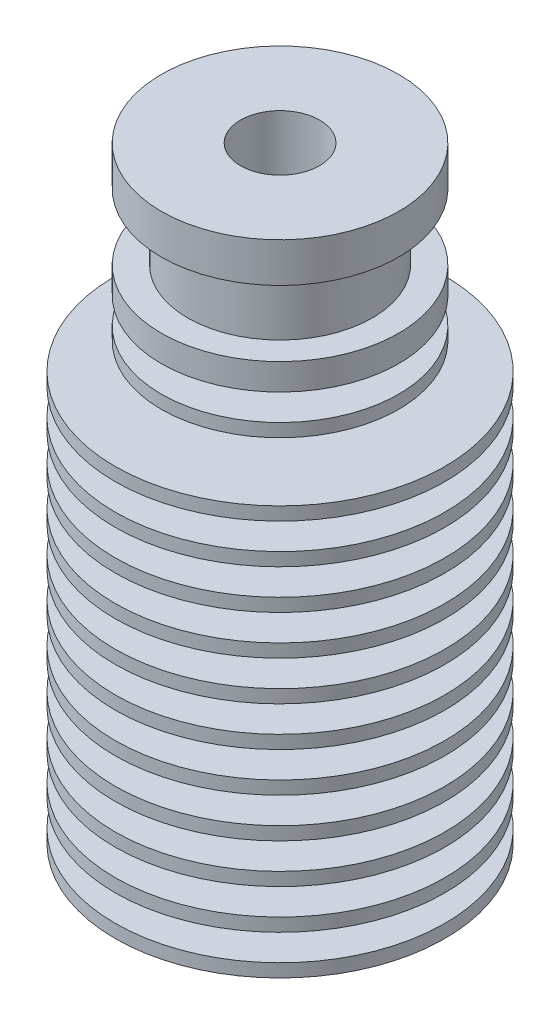
ISO-10303-21;
HEADER;
FILE_DESCRIPTION(('STEP AP214'),'2;1');
FILE_NAME('part.step','',(''),(''),'','','');
FILE_SCHEMA(('AUTOMOTIVE_DESIGN { 1 0 10303 214 1 1 1 1 }'));
ENDSEC;
DATA;
#1=APPLICATION_CONTEXT('core data for automotive mechanical design processes');
#2=APPLICATION_PROTOCOL_DEFINITION('international standard','automotive_design',2000,#1);
#3=PRODUCT_CONTEXT('',#1,'mechanical');
#4=PRODUCT('Part','Part','',(#3));
#5=PRODUCT_RELATED_PRODUCT_CATEGORY('part','',(#4));
#6=PRODUCT_DEFINITION_FORMATION('','',#4);
#7=PRODUCT_DEFINITION_CONTEXT('part definition',#1,'design');
#8=PRODUCT_DEFINITION('design','',#6,#7);
#9=PRODUCT_DEFINITION_SHAPE('','',#8);
#10=(LENGTH_UNIT() NAMED_UNIT(*) SI_UNIT(.MILLI.,.METRE.));
#11=(NAMED_UNIT(*) PLANE_ANGLE_UNIT() SI_UNIT($,.RADIAN.));
#12=(NAMED_UNIT(*) SI_UNIT($,.STERADIAN.) SOLID_ANGLE_UNIT());
#13=UNCERTAINTY_MEASURE_WITH_UNIT(LENGTH_MEASURE(1.E-05),#10,'distance_accuracy_value','');
#14=(GEOMETRIC_REPRESENTATION_CONTEXT(3) GLOBAL_UNCERTAINTY_ASSIGNED_CONTEXT((#13)) GLOBAL_UNIT_ASSIGNED_CONTEXT((#10,
#11,#12)) REPRESENTATION_CONTEXT('',''));
#15=CARTESIAN_POINT('',(0.,0.,0.));
#16=DIRECTION('',(0.,0.,1.));
#17=DIRECTION('',(1.,0.,0.));
#18=AXIS2_PLACEMENT_3D('',#15,#16,#17);
#19=CARTESIAN_POINT('',(0.,1.,0.));
#20=DIRECTION('',(0.,-1.,0.));
#21=DIRECTION('',(0.,0.,-1.));
#22=AXIS2_PLACEMENT_3D('',#19,#20,#21);
#23=CYLINDRICAL_SURFACE('',#22,12.5);
#24=CARTESIAN_POINT('',(0.,1.,0.));
#25=DIRECTION('',(0.,1.,0.));
#26=DIRECTION('',(0.,0.,1.));
#27=AXIS2_PLACEMENT_3D('',#24,#25,#26);
#28=CIRCLE('',#27,12.5);
#29=CARTESIAN_POINT('',(0.,1.,12.5));
#30=VERTEX_POINT('',#29);
#31=EDGE_CURVE('E245',#30,#30,#28,.T.);
#32=ORIENTED_EDGE('',*,*,#31,.F.);
#33=EDGE_LOOP('',(#32));
#34=FACE_BOUND('',#33,.T.);
#35=CARTESIAN_POINT('',(0.,0.,0.));
#36=DIRECTION('',(0.,1.,0.));
#37=DIRECTION('',(0.,0.,1.));
#38=AXIS2_PLACEMENT_3D('',#35,#36,#37);
#39=CIRCLE('',#38,12.5);
#40=CARTESIAN_POINT('',(0.,0.,12.5));
#41=VERTEX_POINT('',#40);
#42=EDGE_CURVE('E42',#41,#41,#39,.T.);
#43=ORIENTED_EDGE('',*,*,#42,.T.);
#44=EDGE_LOOP('',(#43));
#45=FACE_BOUND('',#44,.T.);
#46=ADVANCED_FACE('F39',(#34,#45),#23,.T.);
#47=CARTESIAN_POINT('',(0.,1.,0.));
#48=DIRECTION('',(0.,1.,0.));
#49=DIRECTION('',(0.,0.,1.));
#50=AXIS2_PLACEMENT_3D('',#47,#48,#49);
#51=PLANE('',#50);
#52=CARTESIAN_POINT('',(0.,1.,0.));
#53=DIRECTION('',(0.,1.,0.));
#54=DIRECTION('',(0.,0.,1.));
#55=AXIS2_PLACEMENT_3D('',#52,#53,#54);
#56=CIRCLE('',#55,4.);
#57=CARTESIAN_POINT('',(0.,1.,4.));
#58=VERTEX_POINT('',#57);
#59=EDGE_CURVE('E231',#58,#58,#56,.T.);
#60=ORIENTED_EDGE('',*,*,#59,.F.);
#61=EDGE_LOOP('',(#60));
#62=FACE_BOUND('',#61,.T.);
#63=ORIENTED_EDGE('',*,*,#31,.T.);
#64=EDGE_LOOP('',(#63));
#65=FACE_BOUND('',#64,.T.);
#66=ADVANCED_FACE('F258',(#62,#65),#51,.T.);
#67=CARTESIAN_POINT('',(0.,0.,0.));
#68=DIRECTION('',(0.,1.,0.));
#69=DIRECTION('',(0.,0.,1.));
#70=AXIS2_PLACEMENT_3D('',#67,#68,#69);
#71=PLANE('',#70);
#72=CARTESIAN_POINT('',(0.,0.,0.));
#73=DIRECTION('',(0.,-1.,0.));
#74=DIRECTION('',(0.,0.,-1.));
#75=AXIS2_PLACEMENT_3D('',#72,#73,#74);
#76=CIRCLE('',#75,3.);
#77=CARTESIAN_POINT('',(0.,0.,-3.));
#78=VERTEX_POINT('',#77);
#79=EDGE_CURVE('E816',#78,#78,#76,.T.);
#80=ORIENTED_EDGE('',*,*,#79,.F.);
#81=EDGE_LOOP('',(#80));
#82=FACE_BOUND('',#81,.T.);
#83=ORIENTED_EDGE('',*,*,#42,.F.);
#84=EDGE_LOOP('',(#83));
#85=FACE_BOUND('',#84,.T.);
#86=ADVANCED_FACE('F255',(#82,#85),#71,.F.);
#87=CARTESIAN_POINT('',(0.,3.,0.));
#88=DIRECTION('',(0.,-1.,0.));
#89=DIRECTION('',(0.,0.,-1.));
#90=AXIS2_PLACEMENT_3D('',#87,#88,#89);
#91=CYLINDRICAL_SURFACE('',#90,4.);
#92=CARTESIAN_POINT('',(0.,3.,0.));
#93=DIRECTION('',(0.,1.,0.));
#94=DIRECTION('',(0.,0.,1.));
#95=AXIS2_PLACEMENT_3D('',#92,#93,#94);
#96=CIRCLE('',#95,4.);
#97=CARTESIAN_POINT('',(0.,3.,4.));
#98=VERTEX_POINT('',#97);
#99=EDGE_CURVE('E236',#98,#98,#96,.T.);
#100=ORIENTED_EDGE('',*,*,#99,.F.);
#101=EDGE_LOOP('',(#100));
#102=FACE_BOUND('',#101,.T.);
#103=ORIENTED_EDGE('',*,*,#59,.T.);
#104=EDGE_LOOP('',(#103));
#105=FACE_BOUND('',#104,.T.);
#106=ADVANCED_FACE('F257',(#102,#105),#91,.T.);
#107=CARTESIAN_POINT('',(0.,4.,0.));
#108=DIRECTION('',(0.,-1.,0.));
#109=DIRECTION('',(0.,0.,-1.));
#110=AXIS2_PLACEMENT_3D('',#107,#108,#109);
#111=CYLINDRICAL_SURFACE('',#110,12.5);
#112=CARTESIAN_POINT('',(0.,4.,0.));
#113=DIRECTION('',(0.,1.,0.));
#114=DIRECTION('',(0.,0.,1.));
#115=AXIS2_PLACEMENT_3D('',#112,#113,#114);
#116=CIRCLE('',#115,12.5);
#117=CARTESIAN_POINT('',(0.,4.,12.5));
#118=VERTEX_POINT('',#117);
#119=EDGE_CURVE('E232',#118,#118,#116,.T.);
#120=ORIENTED_EDGE('',*,*,#119,.F.);
#121=EDGE_LOOP('',(#120));
#122=FACE_BOUND('',#121,.T.);
#123=CARTESIAN_POINT('',(0.,3.,0.));
#124=DIRECTION('',(0.,1.,0.));
#125=DIRECTION('',(0.,0.,1.));
#126=AXIS2_PLACEMENT_3D('',#123,#124,#125);
#127=CIRCLE('',#126,12.5);
#128=CARTESIAN_POINT('',(0.,3.,12.5));
#129=VERTEX_POINT('',#128);
#130=EDGE_CURVE('E227',#129,#129,#127,.T.);
#131=ORIENTED_EDGE('',*,*,#130,.T.);
#132=EDGE_LOOP('',(#131));
#133=FACE_BOUND('',#132,.T.);
#134=ADVANCED_FACE('F264',(#122,#133),#111,.T.);
#135=CARTESIAN_POINT('',(0.,4.,0.));
#136=DIRECTION('',(0.,1.,0.));
#137=DIRECTION('',(0.,0.,1.));
#138=AXIS2_PLACEMENT_3D('',#135,#136,#137);
#139=PLANE('',#138);
#140=CARTESIAN_POINT('',(0.,4.,0.));
#141=DIRECTION('',(0.,1.,0.));
#142=DIRECTION('',(0.,0.,1.));
#143=AXIS2_PLACEMENT_3D('',#140,#141,#142);
#144=CIRCLE('',#143,4.);
#145=CARTESIAN_POINT('',(0.,4.,4.));
#146=VERTEX_POINT('',#145);
#147=EDGE_CURVE('E215',#146,#146,#144,.T.);
#148=ORIENTED_EDGE('',*,*,#147,.F.);
#149=EDGE_LOOP('',(#148));
#150=FACE_BOUND('',#149,.T.);
#151=ORIENTED_EDGE('',*,*,#119,.T.);
#152=EDGE_LOOP('',(#151));
#153=FACE_BOUND('',#152,.T.);
#154=ADVANCED_FACE('F294',(#150,#153),#139,.T.);
#155=CARTESIAN_POINT('',(0.,3.,0.));
#156=DIRECTION('',(0.,1.,0.));
#157=DIRECTION('',(0.,0.,1.));
#158=AXIS2_PLACEMENT_3D('',#155,#156,#157);
#159=PLANE('',#158);
#160=ORIENTED_EDGE('',*,*,#99,.T.);
#161=EDGE_LOOP('',(#160));
#162=FACE_BOUND('',#161,.T.);
#163=ORIENTED_EDGE('',*,*,#130,.F.);
#164=EDGE_LOOP('',(#163));
#165=FACE_BOUND('',#164,.T.);
#166=ADVANCED_FACE('F302',(#162,#165),#159,.F.);
#167=CARTESIAN_POINT('',(0.,6.,0.));
#168=DIRECTION('',(0.,-1.,0.));
#169=DIRECTION('',(0.,0.,-1.));
#170=AXIS2_PLACEMENT_3D('',#167,#168,#169);
#171=CYLINDRICAL_SURFACE('',#170,4.);
#172=CARTESIAN_POINT('',(0.,6.,0.));
#173=DIRECTION('',(0.,1.,0.));
#174=DIRECTION('',(0.,0.,1.));
#175=AXIS2_PLACEMENT_3D('',#172,#173,#174);
#176=CIRCLE('',#175,4.);
#177=CARTESIAN_POINT('',(0.,6.,4.));
#178=VERTEX_POINT('',#177);
#179=EDGE_CURVE('E220',#178,#178,#176,.T.);
#180=ORIENTED_EDGE('',*,*,#179,.F.);
#181=EDGE_LOOP('',(#180));
#182=FACE_BOUND('',#181,.T.);
#183=ORIENTED_EDGE('',*,*,#147,.T.);
#184=EDGE_LOOP('',(#183));
#185=FACE_BOUND('',#184,.T.);
#186=ADVANCED_FACE('F307',(#182,#185),#171,.T.);
#187=CARTESIAN_POINT('',(0.,7.,0.));
#188=DIRECTION('',(0.,-1.,0.));
#189=DIRECTION('',(0.,0.,-1.));
#190=AXIS2_PLACEMENT_3D('',#187,#188,#189);
#191=CYLINDRICAL_SURFACE('',#190,12.5);
#192=CARTESIAN_POINT('',(0.,7.,0.));
#193=DIRECTION('',(0.,1.,0.));
#194=DIRECTION('',(0.,0.,1.));
#195=AXIS2_PLACEMENT_3D('',#192,#193,#194);
#196=CIRCLE('',#195,12.5);
#197=CARTESIAN_POINT('',(0.,7.,12.5));
#198=VERTEX_POINT('',#197);
#199=EDGE_CURVE('E216',#198,#198,#196,.T.);
#200=ORIENTED_EDGE('',*,*,#199,.F.);
#201=EDGE_LOOP('',(#200));
#202=FACE_BOUND('',#201,.T.);
#203=CARTESIAN_POINT('',(0.,6.,0.));
#204=DIRECTION('',(0.,1.,0.));
#205=DIRECTION('',(0.,0.,1.));
#206=AXIS2_PLACEMENT_3D('',#203,#204,#205);
#207=CIRCLE('',#206,12.5);
#208=CARTESIAN_POINT('',(0.,6.,12.5));
#209=VERTEX_POINT('',#208);
#210=EDGE_CURVE('E211',#209,#209,#207,.T.);
#211=ORIENTED_EDGE('',*,*,#210,.T.);
#212=EDGE_LOOP('',(#211));
#213=FACE_BOUND('',#212,.T.);
#214=ADVANCED_FACE('F324',(#202,#213),#191,.T.);
#215=CARTESIAN_POINT('',(0.,7.,0.));
#216=DIRECTION('',(0.,1.,0.));
#217=DIRECTION('',(0.,0.,1.));
#218=AXIS2_PLACEMENT_3D('',#215,#216,#217);
#219=PLANE('',#218);
#220=CARTESIAN_POINT('',(0.,7.,0.));
#221=DIRECTION('',(0.,1.,0.));
#222=DIRECTION('',(0.,0.,1.));
#223=AXIS2_PLACEMENT_3D('',#220,#221,#222);
#224=CIRCLE('',#223,4.);
#225=CARTESIAN_POINT('',(0.,7.,4.));
#226=VERTEX_POINT('',#225);
#227=EDGE_CURVE('E199',#226,#226,#224,.T.);
#228=ORIENTED_EDGE('',*,*,#227,.F.);
#229=EDGE_LOOP('',(#228));
#230=FACE_BOUND('',#229,.T.);
#231=ORIENTED_EDGE('',*,*,#199,.T.);
#232=EDGE_LOOP('',(#231));
#233=FACE_BOUND('',#232,.T.);
#234=ADVANCED_FACE('F334',(#230,#233),#219,.T.);
#235=CARTESIAN_POINT('',(0.,6.,0.));
#236=DIRECTION('',(0.,1.,0.));
#237=DIRECTION('',(0.,0.,1.));
#238=AXIS2_PLACEMENT_3D('',#235,#236,#237);
#239=PLANE('',#238);
#240=ORIENTED_EDGE('',*,*,#179,.T.);
#241=EDGE_LOOP('',(#240));
#242=FACE_BOUND('',#241,.T.);
#243=ORIENTED_EDGE('',*,*,#210,.F.);
#244=EDGE_LOOP('',(#243));
#245=FACE_BOUND('',#244,.T.);
#246=ADVANCED_FACE('F342',(#242,#245),#239,.F.);
#247=CARTESIAN_POINT('',(0.,9.,0.));
#248=DIRECTION('',(0.,-1.,0.));
#249=DIRECTION('',(0.,0.,-1.));
#250=AXIS2_PLACEMENT_3D('',#247,#248,#249);
#251=CYLINDRICAL_SURFACE('',#250,4.);
#252=CARTESIAN_POINT('',(0.,9.,0.));
#253=DIRECTION('',(0.,1.,0.));
#254=DIRECTION('',(0.,0.,1.));
#255=AXIS2_PLACEMENT_3D('',#252,#253,#254);
#256=CIRCLE('',#255,4.);
#257=CARTESIAN_POINT('',(0.,9.,4.));
#258=VERTEX_POINT('',#257);
#259=EDGE_CURVE('E204',#258,#258,#256,.T.);
#260=ORIENTED_EDGE('',*,*,#259,.F.);
#261=EDGE_LOOP('',(#260));
#262=FACE_BOUND('',#261,.T.);
#263=ORIENTED_EDGE('',*,*,#227,.T.);
#264=EDGE_LOOP('',(#263));
#265=FACE_BOUND('',#264,.T.);
#266=ADVANCED_FACE('F347',(#262,#265),#251,.T.);
#267=CARTESIAN_POINT('',(0.,10.,0.));
#268=DIRECTION('',(0.,-1.,0.));
#269=DIRECTION('',(0.,0.,-1.));
#270=AXIS2_PLACEMENT_3D('',#267,#268,#269);
#271=CYLINDRICAL_SURFACE('',#270,12.5);
#272=CARTESIAN_POINT('',(0.,10.,0.));
#273=DIRECTION('',(0.,1.,0.));
#274=DIRECTION('',(0.,0.,1.));
#275=AXIS2_PLACEMENT_3D('',#272,#273,#274);
#276=CIRCLE('',#275,12.5);
#277=CARTESIAN_POINT('',(0.,10.,12.5));
#278=VERTEX_POINT('',#277);
#279=EDGE_CURVE('E200',#278,#278,#276,.T.);
#280=ORIENTED_EDGE('',*,*,#279,.F.);
#281=EDGE_LOOP('',(#280));
#282=FACE_BOUND('',#281,.T.);
#283=CARTESIAN_POINT('',(0.,9.,0.));
#284=DIRECTION('',(0.,1.,0.));
#285=DIRECTION('',(0.,0.,1.));
#286=AXIS2_PLACEMENT_3D('',#283,#284,#285);
#287=CIRCLE('',#286,12.5);
#288=CARTESIAN_POINT('',(0.,9.,12.5));
#289=VERTEX_POINT('',#288);
#290=EDGE_CURVE('E195',#289,#289,#287,.T.);
#291=ORIENTED_EDGE('',*,*,#290,.T.);
#292=EDGE_LOOP('',(#291));
#293=FACE_BOUND('',#292,.T.);
#294=ADVANCED_FACE('F364',(#282,#293),#271,.T.);
#295=CARTESIAN_POINT('',(0.,10.,0.));
#296=DIRECTION('',(0.,1.,0.));
#297=DIRECTION('',(0.,0.,1.));
#298=AXIS2_PLACEMENT_3D('',#295,#296,#297);
#299=PLANE('',#298);
#300=CARTESIAN_POINT('',(0.,10.,0.));
#301=DIRECTION('',(0.,1.,0.));
#302=DIRECTION('',(0.,0.,1.));
#303=AXIS2_PLACEMENT_3D('',#300,#301,#302);
#304=CIRCLE('',#303,4.);
#305=CARTESIAN_POINT('',(0.,10.,4.));
#306=VERTEX_POINT('',#305);
#307=EDGE_CURVE('E183',#306,#306,#304,.T.);
#308=ORIENTED_EDGE('',*,*,#307,.F.);
#309=EDGE_LOOP('',(#308));
#310=FACE_BOUND('',#309,.T.);
#311=ORIENTED_EDGE('',*,*,#279,.T.);
#312=EDGE_LOOP('',(#311));
#313=FACE_BOUND('',#312,.T.);
#314=ADVANCED_FACE('F374',(#310,#313),#299,.T.);
#315=CARTESIAN_POINT('',(0.,9.,0.));
#316=DIRECTION('',(0.,1.,0.));
#317=DIRECTION('',(0.,0.,1.));
#318=AXIS2_PLACEMENT_3D('',#315,#316,#317);
#319=PLANE('',#318);
#320=ORIENTED_EDGE('',*,*,#259,.T.);
#321=EDGE_LOOP('',(#320));
#322=FACE_BOUND('',#321,.T.);
#323=ORIENTED_EDGE('',*,*,#290,.F.);
#324=EDGE_LOOP('',(#323));
#325=FACE_BOUND('',#324,.T.);
#326=ADVANCED_FACE('F382',(#322,#325),#319,.F.);
#327=CARTESIAN_POINT('',(0.,12.,0.));
#328=DIRECTION('',(0.,-1.,0.));
#329=DIRECTION('',(0.,0.,-1.));
#330=AXIS2_PLACEMENT_3D('',#327,#328,#329);
#331=CYLINDRICAL_SURFACE('',#330,4.);
#332=CARTESIAN_POINT('',(0.,12.,0.));
#333=DIRECTION('',(0.,1.,0.));
#334=DIRECTION('',(0.,0.,1.));
#335=AXIS2_PLACEMENT_3D('',#332,#333,#334);
#336=CIRCLE('',#335,4.);
#337=CARTESIAN_POINT('',(0.,12.,4.));
#338=VERTEX_POINT('',#337);
#339=EDGE_CURVE('E188',#338,#338,#336,.T.);
#340=ORIENTED_EDGE('',*,*,#339,.F.);
#341=EDGE_LOOP('',(#340));
#342=FACE_BOUND('',#341,.T.);
#343=ORIENTED_EDGE('',*,*,#307,.T.);
#344=EDGE_LOOP('',(#343));
#345=FACE_BOUND('',#344,.T.);
#346=ADVANCED_FACE('F387',(#342,#345),#331,.T.);
#347=CARTESIAN_POINT('',(0.,13.,0.));
#348=DIRECTION('',(0.,-1.,0.));
#349=DIRECTION('',(0.,0.,-1.));
#350=AXIS2_PLACEMENT_3D('',#347,#348,#349);
#351=CYLINDRICAL_SURFACE('',#350,12.5);
#352=CARTESIAN_POINT('',(0.,13.,0.));
#353=DIRECTION('',(0.,1.,0.));
#354=DIRECTION('',(0.,0.,1.));
#355=AXIS2_PLACEMENT_3D('',#352,#353,#354);
#356=CIRCLE('',#355,12.5);
#357=CARTESIAN_POINT('',(0.,13.,12.5));
#358=VERTEX_POINT('',#357);
#359=EDGE_CURVE('E184',#358,#358,#356,.T.);
#360=ORIENTED_EDGE('',*,*,#359,.F.);
#361=EDGE_LOOP('',(#360));
#362=FACE_BOUND('',#361,.T.);
#363=CARTESIAN_POINT('',(0.,12.,0.));
#364=DIRECTION('',(0.,1.,0.));
#365=DIRECTION('',(0.,0.,1.));
#366=AXIS2_PLACEMENT_3D('',#363,#364,#365);
#367=CIRCLE('',#366,12.5);
#368=CARTESIAN_POINT('',(0.,12.,12.5));
#369=VERTEX_POINT('',#368);
#370=EDGE_CURVE('E179',#369,#369,#367,.T.);
#371=ORIENTED_EDGE('',*,*,#370,.T.);
#372=EDGE_LOOP('',(#371));
#373=FACE_BOUND('',#372,.T.);
#374=ADVANCED_FACE('F404',(#362,#373),#351,.T.);
#375=CARTESIAN_POINT('',(0.,13.,0.));
#376=DIRECTION('',(0.,1.,0.));
#377=DIRECTION('',(0.,0.,1.));
#378=AXIS2_PLACEMENT_3D('',#375,#376,#377);
#379=PLANE('',#378);
#380=CARTESIAN_POINT('',(0.,13.,0.));
#381=DIRECTION('',(0.,1.,0.));
#382=DIRECTION('',(0.,0.,1.));
#383=AXIS2_PLACEMENT_3D('',#380,#381,#382);
#384=CIRCLE('',#383,4.);
#385=CARTESIAN_POINT('',(0.,13.,4.));
#386=VERTEX_POINT('',#385);
#387=EDGE_CURVE('E167',#386,#386,#384,.T.);
#388=ORIENTED_EDGE('',*,*,#387,.F.);
#389=EDGE_LOOP('',(#388));
#390=FACE_BOUND('',#389,.T.);
#391=ORIENTED_EDGE('',*,*,#359,.T.);
#392=EDGE_LOOP('',(#391));
#393=FACE_BOUND('',#392,.T.);
#394=ADVANCED_FACE('F414',(#390,#393),#379,.T.);
#395=CARTESIAN_POINT('',(0.,12.,0.));
#396=DIRECTION('',(0.,1.,0.));
#397=DIRECTION('',(0.,0.,1.));
#398=AXIS2_PLACEMENT_3D('',#395,#396,#397);
#399=PLANE('',#398);
#400=ORIENTED_EDGE('',*,*,#339,.T.);
#401=EDGE_LOOP('',(#400));
#402=FACE_BOUND('',#401,.T.);
#403=ORIENTED_EDGE('',*,*,#370,.F.);
#404=EDGE_LOOP('',(#403));
#405=FACE_BOUND('',#404,.T.);
#406=ADVANCED_FACE('F422',(#402,#405),#399,.F.);
#407=CARTESIAN_POINT('',(0.,15.,0.));
#408=DIRECTION('',(0.,-1.,0.));
#409=DIRECTION('',(0.,0.,-1.));
#410=AXIS2_PLACEMENT_3D('',#407,#408,#409);
#411=CYLINDRICAL_SURFACE('',#410,4.);
#412=CARTESIAN_POINT('',(0.,15.,0.));
#413=DIRECTION('',(0.,1.,0.));
#414=DIRECTION('',(0.,0.,1.));
#415=AXIS2_PLACEMENT_3D('',#412,#413,#414);
#416=CIRCLE('',#415,4.);
#417=CARTESIAN_POINT('',(0.,15.,4.));
#418=VERTEX_POINT('',#417);
#419=EDGE_CURVE('E172',#418,#418,#416,.T.);
#420=ORIENTED_EDGE('',*,*,#419,.F.);
#421=EDGE_LOOP('',(#420));
#422=FACE_BOUND('',#421,.T.);
#423=ORIENTED_EDGE('',*,*,#387,.T.);
#424=EDGE_LOOP('',(#423));
#425=FACE_BOUND('',#424,.T.);
#426=ADVANCED_FACE('F427',(#422,#425),#411,.T.);
#427=CARTESIAN_POINT('',(0.,16.,0.));
#428=DIRECTION('',(0.,-1.,0.));
#429=DIRECTION('',(0.,0.,-1.));
#430=AXIS2_PLACEMENT_3D('',#427,#428,#429);
#431=CYLINDRICAL_SURFACE('',#430,12.5);
#432=CARTESIAN_POINT('',(0.,16.,0.));
#433=DIRECTION('',(0.,1.,0.));
#434=DIRECTION('',(0.,0.,1.));
#435=AXIS2_PLACEMENT_3D('',#432,#433,#434);
#436=CIRCLE('',#435,12.5);
#437=CARTESIAN_POINT('',(0.,16.,12.5));
#438=VERTEX_POINT('',#437);
#439=EDGE_CURVE('E168',#438,#438,#436,.T.);
#440=ORIENTED_EDGE('',*,*,#439,.F.);
#441=EDGE_LOOP('',(#440));
#442=FACE_BOUND('',#441,.T.);
#443=CARTESIAN_POINT('',(0.,15.,0.));
#444=DIRECTION('',(0.,1.,0.));
#445=DIRECTION('',(0.,0.,1.));
#446=AXIS2_PLACEMENT_3D('',#443,#444,#445);
#447=CIRCLE('',#446,12.5);
#448=CARTESIAN_POINT('',(0.,15.,12.5));
#449=VERTEX_POINT('',#448);
#450=EDGE_CURVE('E163',#449,#449,#447,.T.);
#451=ORIENTED_EDGE('',*,*,#450,.T.);
#452=EDGE_LOOP('',(#451));
#453=FACE_BOUND('',#452,.T.);
#454=ADVANCED_FACE('F444',(#442,#453),#431,.T.);
#455=CARTESIAN_POINT('',(0.,16.,0.));
#456=DIRECTION('',(0.,1.,0.));
#457=DIRECTION('',(0.,0.,1.));
#458=AXIS2_PLACEMENT_3D('',#455,#456,#457);
#459=PLANE('',#458);
#460=CARTESIAN_POINT('',(0.,16.,0.));
#461=DIRECTION('',(0.,1.,0.));
#462=DIRECTION('',(0.,0.,1.));
#463=AXIS2_PLACEMENT_3D('',#460,#461,#462);
#464=CIRCLE('',#463,4.);
#465=CARTESIAN_POINT('',(0.,16.,4.));
#466=VERTEX_POINT('',#465);
#467=EDGE_CURVE('E151',#466,#466,#464,.T.);
#468=ORIENTED_EDGE('',*,*,#467,.F.);
#469=EDGE_LOOP('',(#468));
#470=FACE_BOUND('',#469,.T.);
#471=ORIENTED_EDGE('',*,*,#439,.T.);
#472=EDGE_LOOP('',(#471));
#473=FACE_BOUND('',#472,.T.);
#474=ADVANCED_FACE('F454',(#470,#473),#459,.T.);
#475=CARTESIAN_POINT('',(0.,15.,0.));
#476=DIRECTION('',(0.,1.,0.));
#477=DIRECTION('',(0.,0.,1.));
#478=AXIS2_PLACEMENT_3D('',#475,#476,#477);
#479=PLANE('',#478);
#480=ORIENTED_EDGE('',*,*,#419,.T.);
#481=EDGE_LOOP('',(#480));
#482=FACE_BOUND('',#481,.T.);
#483=ORIENTED_EDGE('',*,*,#450,.F.);
#484=EDGE_LOOP('',(#483));
#485=FACE_BOUND('',#484,.T.);
#486=ADVANCED_FACE('F462',(#482,#485),#479,.F.);
#487=CARTESIAN_POINT('',(0.,18.,0.));
#488=DIRECTION('',(0.,-1.,0.));
#489=DIRECTION('',(0.,0.,-1.));
#490=AXIS2_PLACEMENT_3D('',#487,#488,#489);
#491=CYLINDRICAL_SURFACE('',#490,4.);
#492=CARTESIAN_POINT('',(0.,18.,0.));
#493=DIRECTION('',(0.,1.,0.));
#494=DIRECTION('',(0.,0.,1.));
#495=AXIS2_PLACEMENT_3D('',#492,#493,#494);
#496=CIRCLE('',#495,4.);
#497=CARTESIAN_POINT('',(0.,18.,4.));
#498=VERTEX_POINT('',#497);
#499=EDGE_CURVE('E156',#498,#498,#496,.T.);
#500=ORIENTED_EDGE('',*,*,#499,.F.);
#501=EDGE_LOOP('',(#500));
#502=FACE_BOUND('',#501,.T.);
#503=ORIENTED_EDGE('',*,*,#467,.T.);
#504=EDGE_LOOP('',(#503));
#505=FACE_BOUND('',#504,.T.);
#506=ADVANCED_FACE('F467',(#502,#505),#491,.T.);
#507=CARTESIAN_POINT('',(0.,19.,0.));
#508=DIRECTION('',(0.,-1.,0.));
#509=DIRECTION('',(0.,0.,-1.));
#510=AXIS2_PLACEMENT_3D('',#507,#508,#509);
#511=CYLINDRICAL_SURFACE('',#510,12.5);
#512=CARTESIAN_POINT('',(0.,19.,0.));
#513=DIRECTION('',(0.,1.,0.));
#514=DIRECTION('',(0.,0.,1.));
#515=AXIS2_PLACEMENT_3D('',#512,#513,#514);
#516=CIRCLE('',#515,12.5);
#517=CARTESIAN_POINT('',(0.,19.,12.5));
#518=VERTEX_POINT('',#517);
#519=EDGE_CURVE('E152',#518,#518,#516,.T.);
#520=ORIENTED_EDGE('',*,*,#519,.F.);
#521=EDGE_LOOP('',(#520));
#522=FACE_BOUND('',#521,.T.);
#523=CARTESIAN_POINT('',(0.,18.,0.));
#524=DIRECTION('',(0.,1.,0.));
#525=DIRECTION('',(0.,0.,1.));
#526=AXIS2_PLACEMENT_3D('',#523,#524,#525);
#527=CIRCLE('',#526,12.5);
#528=CARTESIAN_POINT('',(0.,18.,12.5));
#529=VERTEX_POINT('',#528);
#530=EDGE_CURVE('E147',#529,#529,#527,.T.);
#531=ORIENTED_EDGE('',*,*,#530,.T.);
#532=EDGE_LOOP('',(#531));
#533=FACE_BOUND('',#532,.T.);
#534=ADVANCED_FACE('F484',(#522,#533),#511,.T.);
#535=CARTESIAN_POINT('',(0.,19.,0.));
#536=DIRECTION('',(0.,1.,0.));
#537=DIRECTION('',(0.,0.,1.));
#538=AXIS2_PLACEMENT_3D('',#535,#536,#537);
#539=PLANE('',#538);
#540=CARTESIAN_POINT('',(0.,19.,0.));
#541=DIRECTION('',(0.,1.,0.));
#542=DIRECTION('',(0.,0.,1.));
#543=AXIS2_PLACEMENT_3D('',#540,#541,#542);
#544=CIRCLE('',#543,4.);
#545=CARTESIAN_POINT('',(0.,19.,4.));
#546=VERTEX_POINT('',#545);
#547=EDGE_CURVE('E135',#546,#546,#544,.T.);
#548=ORIENTED_EDGE('',*,*,#547,.F.);
#549=EDGE_LOOP('',(#548));
#550=FACE_BOUND('',#549,.T.);
#551=ORIENTED_EDGE('',*,*,#519,.T.);
#552=EDGE_LOOP('',(#551));
#553=FACE_BOUND('',#552,.T.);
#554=ADVANCED_FACE('F494',(#550,#553),#539,.T.);
#555=CARTESIAN_POINT('',(0.,18.,0.));
#556=DIRECTION('',(0.,1.,0.));
#557=DIRECTION('',(0.,0.,1.));
#558=AXIS2_PLACEMENT_3D('',#555,#556,#557);
#559=PLANE('',#558);
#560=ORIENTED_EDGE('',*,*,#499,.T.);
#561=EDGE_LOOP('',(#560));
#562=FACE_BOUND('',#561,.T.);
#563=ORIENTED_EDGE('',*,*,#530,.F.);
#564=EDGE_LOOP('',(#563));
#565=FACE_BOUND('',#564,.T.);
#566=ADVANCED_FACE('F502',(#562,#565),#559,.F.);
#567=CARTESIAN_POINT('',(0.,21.,0.));
#568=DIRECTION('',(0.,-1.,0.));
#569=DIRECTION('',(0.,0.,-1.));
#570=AXIS2_PLACEMENT_3D('',#567,#568,#569);
#571=CYLINDRICAL_SURFACE('',#570,4.);
#572=CARTESIAN_POINT('',(0.,21.,0.));
#573=DIRECTION('',(0.,1.,0.));
#574=DIRECTION('',(0.,0.,1.));
#575=AXIS2_PLACEMENT_3D('',#572,#573,#574);
#576=CIRCLE('',#575,4.);
#577=CARTESIAN_POINT('',(0.,21.,4.));
#578=VERTEX_POINT('',#577);
#579=EDGE_CURVE('E140',#578,#578,#576,.T.);
#580=ORIENTED_EDGE('',*,*,#579,.F.);
#581=EDGE_LOOP('',(#580));
#582=FACE_BOUND('',#581,.T.);
#583=ORIENTED_EDGE('',*,*,#547,.T.);
#584=EDGE_LOOP('',(#583));
#585=FACE_BOUND('',#584,.T.);
#586=ADVANCED_FACE('F507',(#582,#585),#571,.T.);
#587=CARTESIAN_POINT('',(0.,22.,0.));
#588=DIRECTION('',(0.,-1.,0.));
#589=DIRECTION('',(0.,0.,-1.));
#590=AXIS2_PLACEMENT_3D('',#587,#588,#589);
#591=CYLINDRICAL_SURFACE('',#590,12.5);
#592=CARTESIAN_POINT('',(0.,22.,0.));
#593=DIRECTION('',(0.,1.,0.));
#594=DIRECTION('',(0.,0.,1.));
#595=AXIS2_PLACEMENT_3D('',#592,#593,#594);
#596=CIRCLE('',#595,12.5);
#597=CARTESIAN_POINT('',(0.,22.,12.5));
#598=VERTEX_POINT('',#597);
#599=EDGE_CURVE('E136',#598,#598,#596,.T.);
#600=ORIENTED_EDGE('',*,*,#599,.F.);
#601=EDGE_LOOP('',(#600));
#602=FACE_BOUND('',#601,.T.);
#603=CARTESIAN_POINT('',(0.,21.,0.));
#604=DIRECTION('',(0.,1.,0.));
#605=DIRECTION('',(0.,0.,1.));
#606=AXIS2_PLACEMENT_3D('',#603,#604,#605);
#607=CIRCLE('',#606,12.5);
#608=CARTESIAN_POINT('',(0.,21.,12.5));
#609=VERTEX_POINT('',#608);
#610=EDGE_CURVE('E131',#609,#609,#607,.T.);
#611=ORIENTED_EDGE('',*,*,#610,.T.);
#612=EDGE_LOOP('',(#611));
#613=FACE_BOUND('',#612,.T.);
#614=ADVANCED_FACE('F524',(#602,#613),#591,.T.);
#615=CARTESIAN_POINT('',(0.,22.,0.));
#616=DIRECTION('',(0.,1.,0.));
#617=DIRECTION('',(0.,0.,1.));
#618=AXIS2_PLACEMENT_3D('',#615,#616,#617);
#619=PLANE('',#618);
#620=CARTESIAN_POINT('',(0.,22.,0.));
#621=DIRECTION('',(0.,1.,0.));
#622=DIRECTION('',(0.,0.,1.));
#623=AXIS2_PLACEMENT_3D('',#620,#621,#622);
#624=CIRCLE('',#623,4.);
#625=CARTESIAN_POINT('',(0.,22.,4.));
#626=VERTEX_POINT('',#625);
#627=EDGE_CURVE('E119',#626,#626,#624,.T.);
#628=ORIENTED_EDGE('',*,*,#627,.F.);
#629=EDGE_LOOP('',(#628));
#630=FACE_BOUND('',#629,.T.);
#631=ORIENTED_EDGE('',*,*,#599,.T.);
#632=EDGE_LOOP('',(#631));
#633=FACE_BOUND('',#632,.T.);
#634=ADVANCED_FACE('F534',(#630,#633),#619,.T.);
#635=CARTESIAN_POINT('',(0.,21.,0.));
#636=DIRECTION('',(0.,1.,0.));
#637=DIRECTION('',(0.,0.,1.));
#638=AXIS2_PLACEMENT_3D('',#635,#636,#637);
#639=PLANE('',#638);
#640=ORIENTED_EDGE('',*,*,#579,.T.);
#641=EDGE_LOOP('',(#640));
#642=FACE_BOUND('',#641,.T.);
#643=ORIENTED_EDGE('',*,*,#610,.F.);
#644=EDGE_LOOP('',(#643));
#645=FACE_BOUND('',#644,.T.);
#646=ADVANCED_FACE('F542',(#642,#645),#639,.F.);
#647=CARTESIAN_POINT('',(0.,24.,0.));
#648=DIRECTION('',(0.,-1.,0.));
#649=DIRECTION('',(0.,0.,-1.));
#650=AXIS2_PLACEMENT_3D('',#647,#648,#649);
#651=CYLINDRICAL_SURFACE('',#650,4.);
#652=CARTESIAN_POINT('',(0.,24.,0.));
#653=DIRECTION('',(0.,1.,0.));
#654=DIRECTION('',(0.,0.,1.));
#655=AXIS2_PLACEMENT_3D('',#652,#653,#654);
#656=CIRCLE('',#655,4.);
#657=CARTESIAN_POINT('',(0.,24.,4.));
#658=VERTEX_POINT('',#657);
#659=EDGE_CURVE('E124',#658,#658,#656,.T.);
#660=ORIENTED_EDGE('',*,*,#659,.F.);
#661=EDGE_LOOP('',(#660));
#662=FACE_BOUND('',#661,.T.);
#663=ORIENTED_EDGE('',*,*,#627,.T.);
#664=EDGE_LOOP('',(#663));
#665=FACE_BOUND('',#664,.T.);
#666=ADVANCED_FACE('F547',(#662,#665),#651,.T.);
#667=CARTESIAN_POINT('',(0.,25.,0.));
#668=DIRECTION('',(0.,-1.,0.));
#669=DIRECTION('',(0.,0.,-1.));
#670=AXIS2_PLACEMENT_3D('',#667,#668,#669);
#671=CYLINDRICAL_SURFACE('',#670,12.5);
#672=CARTESIAN_POINT('',(0.,25.,0.));
#673=DIRECTION('',(0.,1.,0.));
#674=DIRECTION('',(0.,0.,1.));
#675=AXIS2_PLACEMENT_3D('',#672,#673,#674);
#676=CIRCLE('',#675,12.5);
#677=CARTESIAN_POINT('',(0.,25.,12.5));
#678=VERTEX_POINT('',#677);
#679=EDGE_CURVE('E120',#678,#678,#676,.T.);
#680=ORIENTED_EDGE('',*,*,#679,.F.);
#681=EDGE_LOOP('',(#680));
#682=FACE_BOUND('',#681,.T.);
#683=CARTESIAN_POINT('',(0.,24.,0.));
#684=DIRECTION('',(0.,1.,0.));
#685=DIRECTION('',(0.,0.,1.));
#686=AXIS2_PLACEMENT_3D('',#683,#684,#685);
#687=CIRCLE('',#686,12.5);
#688=CARTESIAN_POINT('',(0.,24.,12.5));
#689=VERTEX_POINT('',#688);
#690=EDGE_CURVE('E115',#689,#689,#687,.T.);
#691=ORIENTED_EDGE('',*,*,#690,.T.);
#692=EDGE_LOOP('',(#691));
#693=FACE_BOUND('',#692,.T.);
#694=ADVANCED_FACE('F564',(#682,#693),#671,.T.);
#695=CARTESIAN_POINT('',(0.,25.,0.));
#696=DIRECTION('',(0.,1.,0.));
#697=DIRECTION('',(0.,0.,1.));
#698=AXIS2_PLACEMENT_3D('',#695,#696,#697);
#699=PLANE('',#698);
#700=CARTESIAN_POINT('',(0.,25.,0.));
#701=DIRECTION('',(0.,1.,0.));
#702=DIRECTION('',(0.,0.,1.));
#703=AXIS2_PLACEMENT_3D('',#700,#701,#702);
#704=CIRCLE('',#703,4.);
#705=CARTESIAN_POINT('',(0.,25.,4.));
#706=VERTEX_POINT('',#705);
#707=EDGE_CURVE('E103',#706,#706,#704,.T.);
#708=ORIENTED_EDGE('',*,*,#707,.F.);
#709=EDGE_LOOP('',(#708));
#710=FACE_BOUND('',#709,.T.);
#711=ORIENTED_EDGE('',*,*,#679,.T.);
#712=EDGE_LOOP('',(#711));
#713=FACE_BOUND('',#712,.T.);
#714=ADVANCED_FACE('F574',(#710,#713),#699,.T.);
#715=CARTESIAN_POINT('',(0.,24.,0.));
#716=DIRECTION('',(0.,1.,0.));
#717=DIRECTION('',(0.,0.,1.));
#718=AXIS2_PLACEMENT_3D('',#715,#716,#717);
#719=PLANE('',#718);
#720=ORIENTED_EDGE('',*,*,#659,.T.);
#721=EDGE_LOOP('',(#720));
#722=FACE_BOUND('',#721,.T.);
#723=ORIENTED_EDGE('',*,*,#690,.F.);
#724=EDGE_LOOP('',(#723));
#725=FACE_BOUND('',#724,.T.);
#726=ADVANCED_FACE('F582',(#722,#725),#719,.F.);
#727=CARTESIAN_POINT('',(0.,27.,0.));
#728=DIRECTION('',(0.,-1.,0.));
#729=DIRECTION('',(0.,0.,-1.));
#730=AXIS2_PLACEMENT_3D('',#727,#728,#729);
#731=CYLINDRICAL_SURFACE('',#730,4.);
#732=CARTESIAN_POINT('',(0.,27.,0.));
#733=DIRECTION('',(0.,1.,0.));
#734=DIRECTION('',(0.,0.,1.));
#735=AXIS2_PLACEMENT_3D('',#732,#733,#734);
#736=CIRCLE('',#735,4.);
#737=CARTESIAN_POINT('',(0.,27.,4.));
#738=VERTEX_POINT('',#737);
#739=EDGE_CURVE('E108',#738,#738,#736,.T.);
#740=ORIENTED_EDGE('',*,*,#739,.F.);
#741=EDGE_LOOP('',(#740));
#742=FACE_BOUND('',#741,.T.);
#743=ORIENTED_EDGE('',*,*,#707,.T.);
#744=EDGE_LOOP('',(#743));
#745=FACE_BOUND('',#744,.T.);
#746=ADVANCED_FACE('F587',(#742,#745),#731,.T.);
#747=CARTESIAN_POINT('',(0.,28.,0.));
#748=DIRECTION('',(0.,-1.,0.));
#749=DIRECTION('',(0.,0.,-1.));
#750=AXIS2_PLACEMENT_3D('',#747,#748,#749);
#751=CYLINDRICAL_SURFACE('',#750,12.5);
#752=CARTESIAN_POINT('',(0.,28.,0.));
#753=DIRECTION('',(0.,1.,0.));
#754=DIRECTION('',(0.,0.,1.));
#755=AXIS2_PLACEMENT_3D('',#752,#753,#754);
#756=CIRCLE('',#755,12.5);
#757=CARTESIAN_POINT('',(0.,28.,12.5));
#758=VERTEX_POINT('',#757);
#759=EDGE_CURVE('E104',#758,#758,#756,.T.);
#760=ORIENTED_EDGE('',*,*,#759,.F.);
#761=EDGE_LOOP('',(#760));
#762=FACE_BOUND('',#761,.T.);
#763=CARTESIAN_POINT('',(0.,27.,0.));
#764=DIRECTION('',(0.,1.,0.));
#765=DIRECTION('',(0.,0.,1.));
#766=AXIS2_PLACEMENT_3D('',#763,#764,#765);
#767=CIRCLE('',#766,12.5);
#768=CARTESIAN_POINT('',(0.,27.,12.5));
#769=VERTEX_POINT('',#768);
#770=EDGE_CURVE('E99',#769,#769,#767,.T.);
#771=ORIENTED_EDGE('',*,*,#770,.T.);
#772=EDGE_LOOP('',(#771));
#773=FACE_BOUND('',#772,.T.);
#774=ADVANCED_FACE('F604',(#762,#773),#751,.T.);
#775=CARTESIAN_POINT('',(0.,28.,0.));
#776=DIRECTION('',(0.,1.,0.));
#777=DIRECTION('',(0.,0.,1.));
#778=AXIS2_PLACEMENT_3D('',#775,#776,#777);
#779=PLANE('',#778);
#780=CARTESIAN_POINT('',(0.,28.,0.));
#781=DIRECTION('',(0.,1.,0.));
#782=DIRECTION('',(0.,0.,1.));
#783=AXIS2_PLACEMENT_3D('',#780,#781,#782);
#784=CIRCLE('',#783,4.);
#785=CARTESIAN_POINT('',(0.,28.,4.));
#786=VERTEX_POINT('',#785);
#787=EDGE_CURVE('E87',#786,#786,#784,.T.);
#788=ORIENTED_EDGE('',*,*,#787,.F.);
#789=EDGE_LOOP('',(#788));
#790=FACE_BOUND('',#789,.T.);
#791=ORIENTED_EDGE('',*,*,#759,.T.);
#792=EDGE_LOOP('',(#791));
#793=FACE_BOUND('',#792,.T.);
#794=ADVANCED_FACE('F614',(#790,#793),#779,.T.);
#795=CARTESIAN_POINT('',(0.,27.,0.));
#796=DIRECTION('',(0.,1.,0.));
#797=DIRECTION('',(0.,0.,1.));
#798=AXIS2_PLACEMENT_3D('',#795,#796,#797);
#799=PLANE('',#798);
#800=ORIENTED_EDGE('',*,*,#739,.T.);
#801=EDGE_LOOP('',(#800));
#802=FACE_BOUND('',#801,.T.);
#803=ORIENTED_EDGE('',*,*,#770,.F.);
#804=EDGE_LOOP('',(#803));
#805=FACE_BOUND('',#804,.T.);
#806=ADVANCED_FACE('F622',(#802,#805),#799,.F.);
#807=CARTESIAN_POINT('',(0.,30.,0.));
#808=DIRECTION('',(0.,-1.,0.));
#809=DIRECTION('',(0.,0.,-1.));
#810=AXIS2_PLACEMENT_3D('',#807,#808,#809);
#811=CYLINDRICAL_SURFACE('',#810,4.);
#812=CARTESIAN_POINT('',(0.,30.,0.));
#813=DIRECTION('',(0.,1.,0.));
#814=DIRECTION('',(0.,0.,1.));
#815=AXIS2_PLACEMENT_3D('',#812,#813,#814);
#816=CIRCLE('',#815,4.);
#817=CARTESIAN_POINT('',(0.,30.,4.));
#818=VERTEX_POINT('',#817);
#819=EDGE_CURVE('E92',#818,#818,#816,.T.);
#820=ORIENTED_EDGE('',*,*,#819,.F.);
#821=EDGE_LOOP('',(#820));
#822=FACE_BOUND('',#821,.T.);
#823=ORIENTED_EDGE('',*,*,#787,.T.);
#824=EDGE_LOOP('',(#823));
#825=FACE_BOUND('',#824,.T.);
#826=ADVANCED_FACE('F627',(#822,#825),#811,.T.);
#827=CARTESIAN_POINT('',(0.,31.,0.));
#828=DIRECTION('',(0.,-1.,0.));
#829=DIRECTION('',(0.,0.,-1.));
#830=AXIS2_PLACEMENT_3D('',#827,#828,#829);
#831=CYLINDRICAL_SURFACE('',#830,12.5);
#832=CARTESIAN_POINT('',(0.,31.,0.));
#833=DIRECTION('',(0.,1.,0.));
#834=DIRECTION('',(0.,0.,1.));
#835=AXIS2_PLACEMENT_3D('',#832,#833,#834);
#836=CIRCLE('',#835,12.5);
#837=CARTESIAN_POINT('',(0.,31.,12.5));
#838=VERTEX_POINT('',#837);
#839=EDGE_CURVE('E88',#838,#838,#836,.T.);
#840=ORIENTED_EDGE('',*,*,#839,.F.);
#841=EDGE_LOOP('',(#840));
#842=FACE_BOUND('',#841,.T.);
#843=CARTESIAN_POINT('',(0.,30.,0.));
#844=DIRECTION('',(0.,1.,0.));
#845=DIRECTION('',(0.,0.,1.));
#846=AXIS2_PLACEMENT_3D('',#843,#844,#845);
#847=CIRCLE('',#846,12.5);
#848=CARTESIAN_POINT('',(0.,30.,12.5));
#849=VERTEX_POINT('',#848);
#850=EDGE_CURVE('E83',#849,#849,#847,.T.);
#851=ORIENTED_EDGE('',*,*,#850,.T.);
#852=EDGE_LOOP('',(#851));
#853=FACE_BOUND('',#852,.T.);
#854=ADVANCED_FACE('F644',(#842,#853),#831,.T.);
#855=CARTESIAN_POINT('',(0.,31.,0.));
#856=DIRECTION('',(0.,1.,0.));
#857=DIRECTION('',(0.,0.,1.));
#858=AXIS2_PLACEMENT_3D('',#855,#856,#857);
#859=PLANE('',#858);
#860=CARTESIAN_POINT('',(0.,31.,0.));
#861=DIRECTION('',(0.,1.,0.));
#862=DIRECTION('',(0.,0.,1.));
#863=AXIS2_PLACEMENT_3D('',#860,#861,#862);
#864=CIRCLE('',#863,4.);
#865=CARTESIAN_POINT('',(0.,31.,4.));
#866=VERTEX_POINT('',#865);
#867=EDGE_CURVE('E53',#866,#866,#864,.T.);
#868=ORIENTED_EDGE('',*,*,#867,.F.);
#869=EDGE_LOOP('',(#868));
#870=FACE_BOUND('',#869,.T.);
#871=ORIENTED_EDGE('',*,*,#839,.T.);
#872=EDGE_LOOP('',(#871));
#873=FACE_BOUND('',#872,.T.);
#874=ADVANCED_FACE('F654',(#870,#873),#859,.T.);
#875=CARTESIAN_POINT('',(0.,30.,0.));
#876=DIRECTION('',(0.,1.,0.));
#877=DIRECTION('',(0.,0.,1.));
#878=AXIS2_PLACEMENT_3D('',#875,#876,#877);
#879=PLANE('',#878);
#880=ORIENTED_EDGE('',*,*,#819,.T.);
#881=EDGE_LOOP('',(#880));
#882=FACE_BOUND('',#881,.T.);
#883=ORIENTED_EDGE('',*,*,#850,.F.);
#884=EDGE_LOOP('',(#883));
#885=FACE_BOUND('',#884,.T.);
#886=ADVANCED_FACE('F662',(#882,#885),#879,.F.);
#887=CARTESIAN_POINT('',(0.,33.,0.));
#888=DIRECTION('',(0.,-1.,0.));
#889=DIRECTION('',(0.,0.,-1.));
#890=AXIS2_PLACEMENT_3D('',#887,#888,#889);
#891=CYLINDRICAL_SURFACE('',#890,4.);
#892=CARTESIAN_POINT('',(0.,33.,0.));
#893=DIRECTION('',(0.,1.,0.));
#894=DIRECTION('',(0.,0.,1.));
#895=AXIS2_PLACEMENT_3D('',#892,#893,#894);
#896=CIRCLE('',#895,4.);
#897=CARTESIAN_POINT('',(0.,33.,4.));
#898=VERTEX_POINT('',#897);
#899=EDGE_CURVE('E76',#898,#898,#896,.T.);
#900=ORIENTED_EDGE('',*,*,#899,.F.);
#901=EDGE_LOOP('',(#900));
#902=FACE_BOUND('',#901,.T.);
#903=ORIENTED_EDGE('',*,*,#867,.T.);
#904=EDGE_LOOP('',(#903));
#905=FACE_BOUND('',#904,.T.);
#906=ADVANCED_FACE('F667',(#902,#905),#891,.T.);
#907=CARTESIAN_POINT('',(0.,34.,0.));
#908=DIRECTION('',(0.,-1.,0.));
#909=DIRECTION('',(0.,0.,-1.));
#910=AXIS2_PLACEMENT_3D('',#907,#908,#909);
#911=CYLINDRICAL_SURFACE('',#910,9.);
#912=CARTESIAN_POINT('',(0.,34.,0.));
#913=DIRECTION('',(0.,1.,0.));
#914=DIRECTION('',(0.,0.,1.));
#915=AXIS2_PLACEMENT_3D('',#912,#913,#914);
#916=CIRCLE('',#915,9.);
#917=CARTESIAN_POINT('',(0.,34.,9.));
#918=VERTEX_POINT('',#917);
#919=EDGE_CURVE('E72',#918,#918,#916,.T.);
#920=ORIENTED_EDGE('',*,*,#919,.F.);
#921=EDGE_LOOP('',(#920));
#922=FACE_BOUND('',#921,.T.);
#923=CARTESIAN_POINT('',(0.,33.,0.));
#924=DIRECTION('',(0.,1.,0.));
#925=DIRECTION('',(0.,0.,1.));
#926=AXIS2_PLACEMENT_3D('',#923,#924,#925);
#927=CIRCLE('',#926,9.);
#928=CARTESIAN_POINT('',(0.,33.,9.));
#929=VERTEX_POINT('',#928);
#930=EDGE_CURVE('E70',#929,#929,#927,.T.);
#931=ORIENTED_EDGE('',*,*,#930,.T.);
#932=EDGE_LOOP('',(#931));
#933=FACE_BOUND('',#932,.T.);
#934=ADVANCED_FACE('F684',(#922,#933),#911,.T.);
#935=CARTESIAN_POINT('',(0.,34.,0.));
#936=DIRECTION('',(0.,1.,0.));
#937=DIRECTION('',(0.,0.,1.));
#938=AXIS2_PLACEMENT_3D('',#935,#936,#937);
#939=PLANE('',#938);
#940=CARTESIAN_POINT('',(0.,34.,0.));
#941=DIRECTION('',(0.,1.,0.));
#942=DIRECTION('',(0.,0.,1.));
#943=AXIS2_PLACEMENT_3D('',#940,#941,#942);
#944=CIRCLE('',#943,4.);
#945=CARTESIAN_POINT('',(0.,34.,4.));
#946=VERTEX_POINT('',#945);
#947=EDGE_CURVE('E47',#946,#946,#944,.T.);
#948=ORIENTED_EDGE('',*,*,#947,.F.);
#949=EDGE_LOOP('',(#948));
#950=FACE_BOUND('',#949,.T.);
#951=ORIENTED_EDGE('',*,*,#919,.T.);
#952=EDGE_LOOP('',(#951));
#953=FACE_BOUND('',#952,.T.);
#954=ADVANCED_FACE('F694',(#950,#953),#939,.T.);
#955=CARTESIAN_POINT('',(0.,33.,0.));
#956=DIRECTION('',(0.,1.,0.));
#957=DIRECTION('',(0.,0.,1.));
#958=AXIS2_PLACEMENT_3D('',#955,#956,#957);
#959=PLANE('',#958);
#960=ORIENTED_EDGE('',*,*,#899,.T.);
#961=EDGE_LOOP('',(#960));
#962=FACE_BOUND('',#961,.T.);
#963=ORIENTED_EDGE('',*,*,#930,.F.);
#964=EDGE_LOOP('',(#963));
#965=FACE_BOUND('',#964,.T.);
#966=ADVANCED_FACE('F702',(#962,#965),#959,.F.);
#967=CARTESIAN_POINT('',(0.,36.,0.));
#968=DIRECTION('',(0.,-1.,0.));
#969=DIRECTION('',(0.,0.,-1.));
#970=AXIS2_PLACEMENT_3D('',#967,#968,#969);
#971=CYLINDRICAL_SURFACE('',#970,4.);
#972=CARTESIAN_POINT('',(0.,36.,0.));
#973=DIRECTION('',(0.,1.,0.));
#974=DIRECTION('',(0.,0.,1.));
#975=AXIS2_PLACEMENT_3D('',#972,#973,#974);
#976=CIRCLE('',#975,4.);
#977=CARTESIAN_POINT('',(0.,36.,4.));
#978=VERTEX_POINT('',#977);
#979=EDGE_CURVE('E63',#978,#978,#976,.T.);
#980=ORIENTED_EDGE('',*,*,#979,.F.);
#981=EDGE_LOOP('',(#980));
#982=FACE_BOUND('',#981,.T.);
#983=ORIENTED_EDGE('',*,*,#947,.T.);
#984=EDGE_LOOP('',(#983));
#985=FACE_BOUND('',#984,.T.);
#986=ADVANCED_FACE('F707',(#982,#985),#971,.T.);
#987=CARTESIAN_POINT('',(0.,38.,0.));
#988=DIRECTION('',(0.,-1.,0.));
#989=DIRECTION('',(0.,0.,-1.));
#990=AXIS2_PLACEMENT_3D('',#987,#988,#989);
#991=CYLINDRICAL_SURFACE('',#990,9.);
#992=CARTESIAN_POINT('',(0.,38.,0.));
#993=DIRECTION('',(0.,1.,0.));
#994=DIRECTION('',(0.,0.,1.));
#995=AXIS2_PLACEMENT_3D('',#992,#993,#994);
#996=CIRCLE('',#995,9.);
#997=CARTESIAN_POINT('',(0.,38.,9.));
#998=VERTEX_POINT('',#997);
#999=EDGE_CURVE('E59',#998,#998,#996,.T.);
#1000=ORIENTED_EDGE('',*,*,#999,.F.);
#1001=EDGE_LOOP('',(#1000));
#1002=FACE_BOUND('',#1001,.T.);
#1003=CARTESIAN_POINT('',(0.,36.,0.));
#1004=DIRECTION('',(0.,1.,0.));
#1005=DIRECTION('',(0.,0.,1.));
#1006=AXIS2_PLACEMENT_3D('',#1003,#1004,#1005);
#1007=CIRCLE('',#1006,9.);
#1008=CARTESIAN_POINT('',(0.,36.,9.));
#1009=VERTEX_POINT('',#1008);
#1010=EDGE_CURVE('E64',#1009,#1009,#1007,.T.);
#1011=ORIENTED_EDGE('',*,*,#1010,.T.);
#1012=EDGE_LOOP('',(#1011));
#1013=FACE_BOUND('',#1012,.T.);
#1014=ADVANCED_FACE('F724',(#1002,#1013),#991,.T.);
#1015=CARTESIAN_POINT('',(0.,38.,0.));
#1016=DIRECTION('',(0.,1.,0.));
#1017=DIRECTION('',(0.,0.,1.));
#1018=AXIS2_PLACEMENT_3D('',#1015,#1016,#1017);
#1019=PLANE('',#1018);
#1020=CARTESIAN_POINT('',(0.,38.,0.));
#1021=DIRECTION('',(0.,1.,0.));
#1022=DIRECTION('',(0.,0.,1.));
#1023=AXIS2_PLACEMENT_3D('',#1020,#1021,#1022);
#1024=CIRCLE('',#1023,7.);
#1025=CARTESIAN_POINT('',(0.,38.,7.));
#1026=VERTEX_POINT('',#1025);
#1027=EDGE_CURVE('E10',#1026,#1026,#1024,.T.);
#1028=ORIENTED_EDGE('',*,*,#1027,.F.);
#1029=EDGE_LOOP('',(#1028));
#1030=FACE_BOUND('',#1029,.T.);
#1031=ORIENTED_EDGE('',*,*,#999,.T.);
#1032=EDGE_LOOP('',(#1031));
#1033=FACE_BOUND('',#1032,.T.);
#1034=ADVANCED_FACE('F734',(#1030,#1033),#1019,.T.);
#1035=CARTESIAN_POINT('',(0.,36.,0.));
#1036=DIRECTION('',(0.,1.,0.));
#1037=DIRECTION('',(0.,0.,1.));
#1038=AXIS2_PLACEMENT_3D('',#1035,#1036,#1037);
#1039=PLANE('',#1038);
#1040=ORIENTED_EDGE('',*,*,#979,.T.);
#1041=EDGE_LOOP('',(#1040));
#1042=FACE_BOUND('',#1041,.T.);
#1043=ORIENTED_EDGE('',*,*,#1010,.F.);
#1044=EDGE_LOOP('',(#1043));
#1045=FACE_BOUND('',#1044,.T.);
#1046=ADVANCED_FACE('F742',(#1042,#1045),#1039,.F.);
#1047=CARTESIAN_POINT('',(0.,43.,0.));
#1048=DIRECTION('',(0.,-1.,0.));
#1049=DIRECTION('',(0.,0.,-1.));
#1050=AXIS2_PLACEMENT_3D('',#1047,#1048,#1049);
#1051=CYLINDRICAL_SURFACE('',#1050,7.);
#1052=CARTESIAN_POINT('',(0.,43.,0.));
#1053=DIRECTION('',(0.,1.,0.));
#1054=DIRECTION('',(0.,0.,1.));
#1055=AXIS2_PLACEMENT_3D('',#1052,#1053,#1054);
#1056=CIRCLE('',#1055,7.);
#1057=CARTESIAN_POINT('',(0.,43.,7.));
#1058=VERTEX_POINT('',#1057);
#1059=EDGE_CURVE('E57',#1058,#1058,#1056,.T.);
#1060=ORIENTED_EDGE('',*,*,#1059,.F.);
#1061=EDGE_LOOP('',(#1060));
#1062=FACE_BOUND('',#1061,.T.);
#1063=ORIENTED_EDGE('',*,*,#1027,.T.);
#1064=EDGE_LOOP('',(#1063));
#1065=FACE_BOUND('',#1064,.T.);
#1066=ADVANCED_FACE('F747',(#1062,#1065),#1051,.T.);
#1067=CARTESIAN_POINT('',(0.,46.,0.));
#1068=DIRECTION('',(0.,-1.,0.));
#1069=DIRECTION('',(0.,0.,-1.));
#1070=AXIS2_PLACEMENT_3D('',#1067,#1068,#1069);
#1071=CYLINDRICAL_SURFACE('',#1070,9.);
#1072=CARTESIAN_POINT('',(0.,46.,0.));
#1073=DIRECTION('',(0.,1.,0.));
#1074=DIRECTION('',(0.,0.,1.));
#1075=AXIS2_PLACEMENT_3D('',#1072,#1073,#1074);
#1076=CIRCLE('',#1075,9.);
#1077=CARTESIAN_POINT('',(0.,46.,9.));
#1078=VERTEX_POINT('',#1077);
#1079=EDGE_CURVE('E823',#1078,#1078,#1076,.T.);
#1080=ORIENTED_EDGE('',*,*,#1079,.F.);
#1081=EDGE_LOOP('',(#1080));
#1082=FACE_BOUND('',#1081,.T.);
#1083=CARTESIAN_POINT('',(0.,43.,0.));
#1084=DIRECTION('',(0.,1.,0.));
#1085=DIRECTION('',(0.,0.,1.));
#1086=AXIS2_PLACEMENT_3D('',#1083,#1084,#1085);
#1087=CIRCLE('',#1086,9.);
#1088=CARTESIAN_POINT('',(0.,43.,9.));
#1089=VERTEX_POINT('',#1088);
#1090=EDGE_CURVE('E820',#1089,#1089,#1087,.T.);
#1091=ORIENTED_EDGE('',*,*,#1090,.T.);
#1092=EDGE_LOOP('',(#1091));
#1093=FACE_BOUND('',#1092,.T.);
#1094=ADVANCED_FACE('F764',(#1082,#1093),#1071,.T.);
#1095=CARTESIAN_POINT('',(0.,46.,0.));
#1096=DIRECTION('',(0.,1.,0.));
#1097=DIRECTION('',(0.,0.,1.));
#1098=AXIS2_PLACEMENT_3D('',#1095,#1096,#1097);
#1099=PLANE('',#1098);
#1100=CARTESIAN_POINT('',(0.,46.,0.));
#1101=DIRECTION('',(0.,-1.,0.));
#1102=DIRECTION('',(0.,0.,-1.));
#1103=AXIS2_PLACEMENT_3D('',#1100,#1101,#1102);
#1104=CIRCLE('',#1103,3.);
#1105=CARTESIAN_POINT('',(0.,46.,-3.));
#1106=VERTEX_POINT('',#1105);
#1107=EDGE_CURVE('E814',#1106,#1106,#1104,.T.);
#1108=ORIENTED_EDGE('',*,*,#1107,.T.);
#1109=EDGE_LOOP('',(#1108));
#1110=FACE_BOUND('',#1109,.T.);
#1111=ORIENTED_EDGE('',*,*,#1079,.T.);
#1112=EDGE_LOOP('',(#1111));
#1113=FACE_BOUND('',#1112,.T.);
#1114=ADVANCED_FACE('F774',(#1110,#1113),#1099,.T.);
#1115=CARTESIAN_POINT('',(0.,43.,0.));
#1116=DIRECTION('',(0.,1.,0.));
#1117=DIRECTION('',(0.,0.,1.));
#1118=AXIS2_PLACEMENT_3D('',#1115,#1116,#1117);
#1119=PLANE('',#1118);
#1120=ORIENTED_EDGE('',*,*,#1059,.T.);
#1121=EDGE_LOOP('',(#1120));
#1122=FACE_BOUND('',#1121,.T.);
#1123=ORIENTED_EDGE('',*,*,#1090,.F.);
#1124=EDGE_LOOP('',(#1123));
#1125=FACE_BOUND('',#1124,.T.);
#1126=ADVANCED_FACE('F782',(#1122,#1125),#1119,.F.);
#1127=CARTESIAN_POINT('',(0.,46.,0.));
#1128=DIRECTION('',(0.,-1.,0.));
#1129=DIRECTION('',(0.,0.,-1.));
#1130=AXIS2_PLACEMENT_3D('',#1127,#1128,#1129);
#1131=CYLINDRICAL_SURFACE('',#1130,3.);
#1132=ORIENTED_EDGE('',*,*,#1107,.F.);
#1133=EDGE_LOOP('',(#1132));
#1134=FACE_BOUND('',#1133,.T.);
#1135=ORIENTED_EDGE('',*,*,#79,.T.);
#1136=EDGE_LOOP('',(#1135));
#1137=FACE_BOUND('',#1136,.T.);
#1138=ADVANCED_FACE('F786',(#1134,#1137),#1131,.F.);
#1139=CLOSED_SHELL('',(#46,#66,#86,#106,#134,#154,#166,#186,#214,#234,#246,#266,#294,#314,#326,
#346,#374,#394,#406,#426,#454,#474,#486,#506,#534,#554,#566,#586,#614,#634,#646,#666,#694,#714,
#726,#746,#774,#794,#806,#826,#854,#874,#886,#906,#934,#954,#966,#986,#1014,#1034,#1046,#1066,
#1094,#1114,#1126,#1138));
#1140=MANIFOLD_SOLID_BREP('B2',#1139);
#1141=ADVANCED_BREP_SHAPE_REPRESENTATION('',(#18,#1140),#14);
#1142=SHAPE_DEFINITION_REPRESENTATION(#9,#1141);
ENDSEC;
END-ISO-10303-21;
